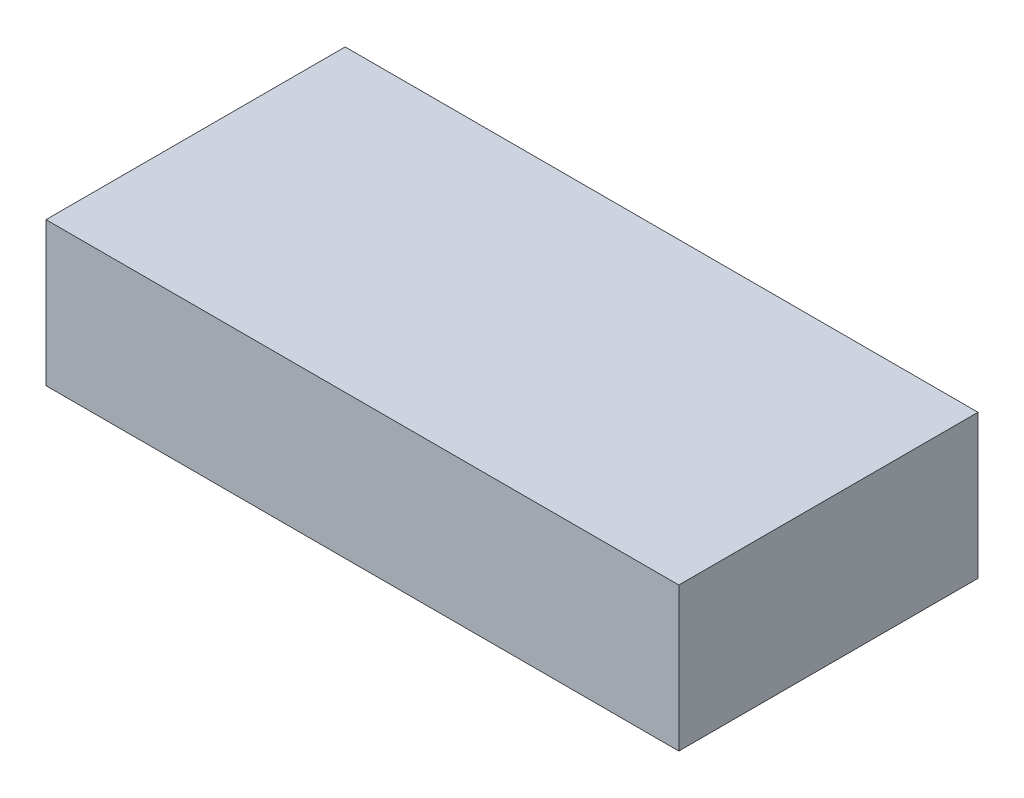
ISO-10303-21;
HEADER;
FILE_DESCRIPTION(('STEP AP214'),'2;1');
FILE_NAME('part.step','',(''),(''),'','','');
FILE_SCHEMA(('AUTOMOTIVE_DESIGN { 1 0 10303 214 1 1 1 1 }'));
ENDSEC;
DATA;
#1=APPLICATION_CONTEXT('core data for automotive mechanical design processes');
#2=APPLICATION_PROTOCOL_DEFINITION('international standard','automotive_design',2000,#1);
#3=PRODUCT_CONTEXT('',#1,'mechanical');
#4=PRODUCT('Part','Part','',(#3));
#5=PRODUCT_RELATED_PRODUCT_CATEGORY('part','',(#4));
#6=PRODUCT_DEFINITION_FORMATION('','',#4);
#7=PRODUCT_DEFINITION_CONTEXT('part definition',#1,'design');
#8=PRODUCT_DEFINITION('design','',#6,#7);
#9=PRODUCT_DEFINITION_SHAPE('','',#8);
#10=(LENGTH_UNIT() NAMED_UNIT(*) SI_UNIT(.MILLI.,.METRE.));
#11=(NAMED_UNIT(*) PLANE_ANGLE_UNIT() SI_UNIT($,.RADIAN.));
#12=(NAMED_UNIT(*) SI_UNIT($,.STERADIAN.) SOLID_ANGLE_UNIT());
#13=UNCERTAINTY_MEASURE_WITH_UNIT(LENGTH_MEASURE(1.E-05),#10,'distance_accuracy_value','');
#14=(GEOMETRIC_REPRESENTATION_CONTEXT(3) GLOBAL_UNCERTAINTY_ASSIGNED_CONTEXT((#13)) GLOBAL_UNIT_ASSIGNED_CONTEXT((#10,
#11,#12)) REPRESENTATION_CONTEXT('',''));
#15=CARTESIAN_POINT('',(0.,0.,0.));
#16=DIRECTION('',(0.,0.,1.));
#17=DIRECTION('',(1.,0.,0.));
#18=AXIS2_PLACEMENT_3D('',#15,#16,#17);
#19=CARTESIAN_POINT('',(55.,25.,26.));
#20=DIRECTION('',(-1.,0.,0.));
#21=DIRECTION('',(0.,0.,1.));
#22=AXIS2_PLACEMENT_3D('',#19,#20,#21);
#23=PLANE('',#22);
#24=DIRECTION('',(0.,0.,-1.));
#25=VECTOR('',#24,1.);
#26=CARTESIAN_POINT('',(55.,0.,26.));
#27=LINE('',#26,#25);
#28=CARTESIAN_POINT('',(55.,0.,26.));
#29=VERTEX_POINT('',#28);
#30=CARTESIAN_POINT('',(55.,0.,-26.));
#31=VERTEX_POINT('',#30);
#32=EDGE_CURVE('E96',#29,#31,#27,.T.);
#33=ORIENTED_EDGE('',*,*,#32,.T.);
#34=DIRECTION('',(0.,-1.,0.));
#35=VECTOR('',#34,1.);
#36=CARTESIAN_POINT('',(55.,25.,-26.));
#37=LINE('',#36,#35);
#38=CARTESIAN_POINT('',(55.,25.,-26.));
#39=VERTEX_POINT('',#38);
#40=EDGE_CURVE('E11',#39,#31,#37,.T.);
#41=ORIENTED_EDGE('',*,*,#40,.F.);
#42=DIRECTION('',(0.,0.,-1.));
#43=VECTOR('',#42,1.);
#44=CARTESIAN_POINT('',(55.,25.,26.));
#45=LINE('',#44,#43);
#46=CARTESIAN_POINT('',(55.,25.,26.));
#47=VERTEX_POINT('',#46);
#48=EDGE_CURVE('E84',#47,#39,#45,.T.);
#49=ORIENTED_EDGE('',*,*,#48,.F.);
#50=DIRECTION('',(0.,-1.,0.));
#51=VECTOR('',#50,1.);
#52=CARTESIAN_POINT('',(55.,25.,26.));
#53=LINE('',#52,#51);
#54=EDGE_CURVE('E92',#47,#29,#53,.T.);
#55=ORIENTED_EDGE('',*,*,#54,.T.);
#56=EDGE_LOOP('',(#33,#41,#49,#55));
#57=FACE_BOUND('',#56,.T.);
#58=ADVANCED_FACE('F33',(#57),#23,.F.);
#59=CARTESIAN_POINT('',(-55.,25.,-26.));
#60=DIRECTION('',(0.,0.,1.));
#61=DIRECTION('',(1.,0.,0.));
#62=AXIS2_PLACEMENT_3D('',#59,#60,#61);
#63=PLANE('',#62);
#64=DIRECTION('',(-1.,0.,0.));
#65=VECTOR('',#64,1.);
#66=CARTESIAN_POINT('',(-55.,0.,-26.));
#67=LINE('',#66,#65);
#68=CARTESIAN_POINT('',(-55.,0.,-26.));
#69=VERTEX_POINT('',#68);
#70=EDGE_CURVE('E88',#31,#69,#67,.T.);
#71=ORIENTED_EDGE('',*,*,#70,.T.);
#72=DIRECTION('',(0.,-1.,0.));
#73=VECTOR('',#72,1.);
#74=CARTESIAN_POINT('',(-55.,25.,-26.));
#75=LINE('',#74,#73);
#76=CARTESIAN_POINT('',(-55.,25.,-26.));
#77=VERTEX_POINT('',#76);
#78=EDGE_CURVE('E41',#77,#69,#75,.T.);
#79=ORIENTED_EDGE('',*,*,#78,.F.);
#80=DIRECTION('',(-1.,0.,0.));
#81=VECTOR('',#80,1.);
#82=CARTESIAN_POINT('',(-55.,25.,-26.));
#83=LINE('',#82,#81);
#84=EDGE_CURVE('E79',#39,#77,#83,.T.);
#85=ORIENTED_EDGE('',*,*,#84,.F.);
#86=ORIENTED_EDGE('',*,*,#40,.T.);
#87=EDGE_LOOP('',(#71,#79,#85,#86));
#88=FACE_BOUND('',#87,.T.);
#89=ADVANCED_FACE('F87',(#88),#63,.F.);
#90=CARTESIAN_POINT('',(-55.,25.,26.));
#91=DIRECTION('',(1.,0.,0.));
#92=DIRECTION('',(0.,0.,-1.));
#93=AXIS2_PLACEMENT_3D('',#90,#91,#92);
#94=PLANE('',#93);
#95=DIRECTION('',(0.,0.,1.));
#96=VECTOR('',#95,1.);
#97=CARTESIAN_POINT('',(-55.,0.,26.));
#98=LINE('',#97,#96);
#99=CARTESIAN_POINT('',(-55.,0.,26.));
#100=VERTEX_POINT('',#99);
#101=EDGE_CURVE('E66',#69,#100,#98,.T.);
#102=ORIENTED_EDGE('',*,*,#101,.T.);
#103=DIRECTION('',(0.,-1.,0.));
#104=VECTOR('',#103,1.);
#105=CARTESIAN_POINT('',(-55.,25.,26.));
#106=LINE('',#105,#104);
#107=CARTESIAN_POINT('',(-55.,25.,26.));
#108=VERTEX_POINT('',#107);
#109=EDGE_CURVE('E89',#108,#100,#106,.T.);
#110=ORIENTED_EDGE('',*,*,#109,.F.);
#111=DIRECTION('',(0.,0.,1.));
#112=VECTOR('',#111,1.);
#113=CARTESIAN_POINT('',(-55.,25.,26.));
#114=LINE('',#113,#112);
#115=EDGE_CURVE('E82',#77,#108,#114,.T.);
#116=ORIENTED_EDGE('',*,*,#115,.F.);
#117=ORIENTED_EDGE('',*,*,#78,.T.);
#118=EDGE_LOOP('',(#102,#110,#116,#117));
#119=FACE_BOUND('',#118,.T.);
#120=ADVANCED_FACE('F90',(#119),#94,.F.);
#121=CARTESIAN_POINT('',(-55.,25.,26.));
#122=DIRECTION('',(0.,0.,-1.));
#123=DIRECTION('',(-1.,0.,0.));
#124=AXIS2_PLACEMENT_3D('',#121,#122,#123);
#125=PLANE('',#124);
#126=DIRECTION('',(1.,0.,0.));
#127=VECTOR('',#126,1.);
#128=CARTESIAN_POINT('',(-55.,0.,26.));
#129=LINE('',#128,#127);
#130=EDGE_CURVE('E72',#100,#29,#129,.T.);
#131=ORIENTED_EDGE('',*,*,#130,.T.);
#132=ORIENTED_EDGE('',*,*,#54,.F.);
#133=DIRECTION('',(1.,0.,0.));
#134=VECTOR('',#133,1.);
#135=CARTESIAN_POINT('',(-55.,25.,26.));
#136=LINE('',#135,#134);
#137=EDGE_CURVE('E49',#108,#47,#136,.T.);
#138=ORIENTED_EDGE('',*,*,#137,.F.);
#139=ORIENTED_EDGE('',*,*,#109,.T.);
#140=EDGE_LOOP('',(#131,#132,#138,#139));
#141=FACE_BOUND('',#140,.T.);
#142=ADVANCED_FACE('F103',(#141),#125,.F.);
#143=CARTESIAN_POINT('',(0.,25.,0.));
#144=DIRECTION('',(0.,-1.,0.));
#145=DIRECTION('',(0.,0.,-1.));
#146=AXIS2_PLACEMENT_3D('',#143,#144,#145);
#147=PLANE('',#146);
#148=ORIENTED_EDGE('',*,*,#48,.T.);
#149=ORIENTED_EDGE('',*,*,#84,.T.);
#150=ORIENTED_EDGE('',*,*,#115,.T.);
#151=ORIENTED_EDGE('',*,*,#137,.T.);
#152=EDGE_LOOP('',(#148,#149,#150,#151));
#153=FACE_BOUND('',#152,.T.);
#154=ADVANCED_FACE('F80',(#153),#147,.F.);
#155=CARTESIAN_POINT('',(0.,0.,0.));
#156=DIRECTION('',(0.,-1.,0.));
#157=DIRECTION('',(0.,0.,-1.));
#158=AXIS2_PLACEMENT_3D('',#155,#156,#157);
#159=PLANE('',#158);
#160=ORIENTED_EDGE('',*,*,#32,.F.);
#161=ORIENTED_EDGE('',*,*,#130,.F.);
#162=ORIENTED_EDGE('',*,*,#101,.F.);
#163=ORIENTED_EDGE('',*,*,#70,.F.);
#164=EDGE_LOOP('',(#160,#161,#162,#163));
#165=FACE_BOUND('',#164,.T.);
#166=ADVANCED_FACE('F106',(#165),#159,.T.);
#167=CLOSED_SHELL('',(#58,#89,#120,#142,#154,#166));
#168=MANIFOLD_SOLID_BREP('B2',#167);
#169=ADVANCED_BREP_SHAPE_REPRESENTATION('',(#18,#168),#14);
#170=SHAPE_DEFINITION_REPRESENTATION(#9,#169);
ENDSEC;
END-ISO-10303-21;
